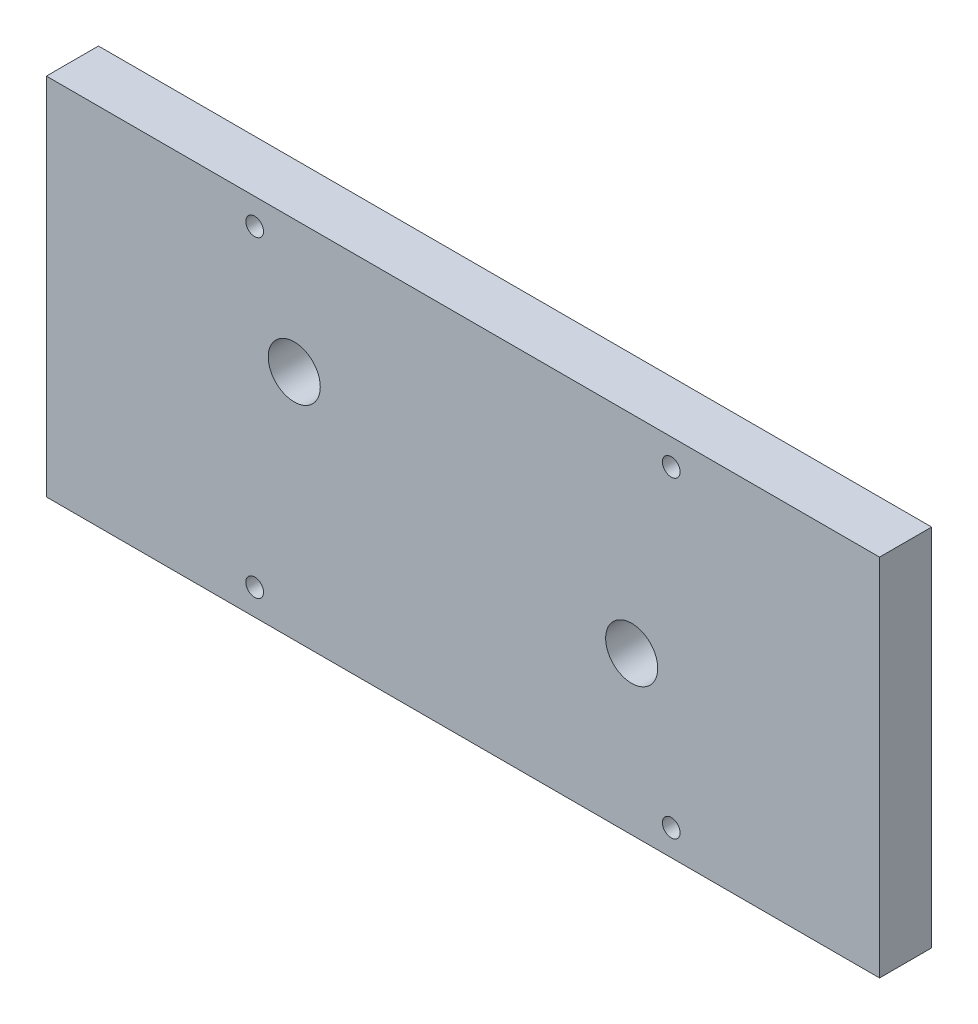
ISO-10303-21;
HEADER;
FILE_DESCRIPTION(('STEP AP214'),'2;1');
FILE_NAME('part.step','',(''),(''),'','','');
FILE_SCHEMA(('AUTOMOTIVE_DESIGN { 1 0 10303 214 1 1 1 1 }'));
ENDSEC;
DATA;
#1=APPLICATION_CONTEXT('core data for automotive mechanical design processes');
#2=APPLICATION_PROTOCOL_DEFINITION('international standard','automotive_design',2000,#1);
#3=PRODUCT_CONTEXT('',#1,'mechanical');
#4=PRODUCT('Part','Part','',(#3));
#5=PRODUCT_RELATED_PRODUCT_CATEGORY('part','',(#4));
#6=PRODUCT_DEFINITION_FORMATION('','',#4);
#7=PRODUCT_DEFINITION_CONTEXT('part definition',#1,'design');
#8=PRODUCT_DEFINITION('design','',#6,#7);
#9=PRODUCT_DEFINITION_SHAPE('','',#8);
#10=(LENGTH_UNIT() NAMED_UNIT(*) SI_UNIT(.MILLI.,.METRE.));
#11=(NAMED_UNIT(*) PLANE_ANGLE_UNIT() SI_UNIT($,.RADIAN.));
#12=(NAMED_UNIT(*) SI_UNIT($,.STERADIAN.) SOLID_ANGLE_UNIT());
#13=UNCERTAINTY_MEASURE_WITH_UNIT(LENGTH_MEASURE(1.E-05),#10,'distance_accuracy_value','');
#14=(GEOMETRIC_REPRESENTATION_CONTEXT(3) GLOBAL_UNCERTAINTY_ASSIGNED_CONTEXT((#13)) GLOBAL_UNIT_ASSIGNED_CONTEXT((#10,
#11,#12)) REPRESENTATION_CONTEXT('',''));
#15=CARTESIAN_POINT('',(0.,0.,0.));
#16=DIRECTION('',(0.,0.,1.));
#17=DIRECTION('',(1.,0.,0.));
#18=AXIS2_PLACEMENT_3D('',#15,#16,#17);
#19=CARTESIAN_POINT('',(-146.819307324439,520.108658774627,82.2731107004053));
#20=DIRECTION('',(1.,0.,0.));
#21=DIRECTION('',(0.,0.,-1.));
#22=AXIS2_PLACEMENT_3D('',#19,#20,#21);
#23=PLANE('',#22);
#24=DIRECTION('',(0.,1.,0.));
#25=VECTOR('',#24,1.);
#26=CARTESIAN_POINT('',(-146.819307324439,520.108658774627,92.2731107004053));
#27=LINE('',#26,#25);
#28=CARTESIAN_POINT('',(-146.819307324439,450.108658774627,92.2731107004053));
#29=VERTEX_POINT('',#28);
#30=CARTESIAN_POINT('',(-146.819307324439,520.108658774627,92.2731107004053));
#31=VERTEX_POINT('',#30);
#32=EDGE_CURVE('E98',#29,#31,#27,.T.);
#33=ORIENTED_EDGE('',*,*,#32,.T.);
#34=DIRECTION('',(0.,0.,1.));
#35=VECTOR('',#34,1.);
#36=CARTESIAN_POINT('',(-146.819307324439,520.108658774627,82.2731107004053));
#37=LINE('',#36,#35);
#38=CARTESIAN_POINT('',(-146.819307324439,520.108658774627,82.2731107004053));
#39=VERTEX_POINT('',#38);
#40=EDGE_CURVE('E11',#39,#31,#37,.T.);
#41=ORIENTED_EDGE('',*,*,#40,.F.);
#42=DIRECTION('',(0.,1.,0.));
#43=VECTOR('',#42,1.);
#44=CARTESIAN_POINT('',(-146.819307324439,520.108658774627,82.2731107004053));
#45=LINE('',#44,#43);
#46=CARTESIAN_POINT('',(-146.819307324439,450.108658774627,82.2731107004053));
#47=VERTEX_POINT('',#46);
#48=EDGE_CURVE('E85',#47,#39,#45,.T.);
#49=ORIENTED_EDGE('',*,*,#48,.F.);
#50=DIRECTION('',(0.,0.,1.));
#51=VECTOR('',#50,1.);
#52=CARTESIAN_POINT('',(-146.819307324439,450.108658774627,82.2731107004053));
#53=LINE('',#52,#51);
#54=EDGE_CURVE('E94',#47,#29,#53,.T.);
#55=ORIENTED_EDGE('',*,*,#54,.T.);
#56=EDGE_LOOP('',(#33,#41,#49,#55));
#57=FACE_BOUND('',#56,.T.);
#58=ADVANCED_FACE('F32',(#57),#23,.F.);
#59=CARTESIAN_POINT('',(-146.819307324439,520.108658774627,82.2731107004053));
#60=DIRECTION('',(0.,-1.,0.));
#61=DIRECTION('',(0.,0.,-1.));
#62=AXIS2_PLACEMENT_3D('',#59,#60,#61);
#63=PLANE('',#62);
#64=DIRECTION('',(1.,0.,0.));
#65=VECTOR('',#64,1.);
#66=CARTESIAN_POINT('',(-146.819307324439,520.108658774627,92.2731107004053));
#67=LINE('',#66,#65);
#68=CARTESIAN_POINT('',(13.1806926755614,520.108658774627,92.2731107004053));
#69=VERTEX_POINT('',#68);
#70=EDGE_CURVE('E89',#31,#69,#67,.T.);
#71=ORIENTED_EDGE('',*,*,#70,.T.);
#72=DIRECTION('',(0.,0.,1.));
#73=VECTOR('',#72,1.);
#74=CARTESIAN_POINT('',(13.1806926755614,520.108658774627,82.2731107004053));
#75=LINE('',#74,#73);
#76=CARTESIAN_POINT('',(13.1806926755614,520.108658774627,82.2731107004053));
#77=VERTEX_POINT('',#76);
#78=EDGE_CURVE('E41',#77,#69,#75,.T.);
#79=ORIENTED_EDGE('',*,*,#78,.F.);
#80=DIRECTION('',(1.,0.,0.));
#81=VECTOR('',#80,1.);
#82=CARTESIAN_POINT('',(-146.819307324439,520.108658774627,82.2731107004053));
#83=LINE('',#82,#81);
#84=EDGE_CURVE('E80',#39,#77,#83,.T.);
#85=ORIENTED_EDGE('',*,*,#84,.F.);
#86=ORIENTED_EDGE('',*,*,#40,.T.);
#87=EDGE_LOOP('',(#71,#79,#85,#86));
#88=FACE_BOUND('',#87,.T.);
#89=ADVANCED_FACE('F88',(#88),#63,.F.);
#90=CARTESIAN_POINT('',(13.1806926755614,520.108658774627,82.2731107004053));
#91=DIRECTION('',(-1.,0.,0.));
#92=DIRECTION('',(0.,-1.,0.));
#93=AXIS2_PLACEMENT_3D('',#90,#91,#92);
#94=PLANE('',#93);
#95=DIRECTION('',(0.,-1.,0.));
#96=VECTOR('',#95,1.);
#97=CARTESIAN_POINT('',(13.1806926755614,520.108658774627,92.2731107004053));
#98=LINE('',#97,#96);
#99=CARTESIAN_POINT('',(13.1806926755614,450.108658774627,92.2731107004053));
#100=VERTEX_POINT('',#99);
#101=EDGE_CURVE('E67',#69,#100,#98,.T.);
#102=ORIENTED_EDGE('',*,*,#101,.T.);
#103=DIRECTION('',(0.,0.,1.));
#104=VECTOR('',#103,1.);
#105=CARTESIAN_POINT('',(13.1806926755614,450.108658774627,82.2731107004053));
#106=LINE('',#105,#104);
#107=CARTESIAN_POINT('',(13.1806926755614,450.108658774627,82.2731107004053));
#108=VERTEX_POINT('',#107);
#109=EDGE_CURVE('E90',#108,#100,#106,.T.);
#110=ORIENTED_EDGE('',*,*,#109,.F.);
#111=DIRECTION('',(0.,-1.,0.));
#112=VECTOR('',#111,1.);
#113=CARTESIAN_POINT('',(13.1806926755614,520.108658774627,82.2731107004053));
#114=LINE('',#113,#112);
#115=EDGE_CURVE('E83',#77,#108,#114,.T.);
#116=ORIENTED_EDGE('',*,*,#115,.F.);
#117=ORIENTED_EDGE('',*,*,#78,.T.);
#118=EDGE_LOOP('',(#102,#110,#116,#117));
#119=FACE_BOUND('',#118,.T.);
#120=ADVANCED_FACE('F92',(#119),#94,.F.);
#121=CARTESIAN_POINT('',(-146.819307324439,450.108658774627,82.2731107004053));
#122=DIRECTION('',(0.,1.,0.));
#123=DIRECTION('',(0.,0.,1.));
#124=AXIS2_PLACEMENT_3D('',#121,#122,#123);
#125=PLANE('',#124);
#126=DIRECTION('',(-1.,0.,0.));
#127=VECTOR('',#126,1.);
#128=CARTESIAN_POINT('',(-146.819307324439,450.108658774627,92.2731107004053));
#129=LINE('',#128,#127);
#130=EDGE_CURVE('E73',#100,#29,#129,.T.);
#131=ORIENTED_EDGE('',*,*,#130,.T.);
#132=ORIENTED_EDGE('',*,*,#54,.F.);
#133=DIRECTION('',(-1.,0.,0.));
#134=VECTOR('',#133,1.);
#135=CARTESIAN_POINT('',(-146.819307324439,450.108658774627,82.2731107004053));
#136=LINE('',#135,#134);
#137=EDGE_CURVE('E50',#108,#47,#136,.T.);
#138=ORIENTED_EDGE('',*,*,#137,.F.);
#139=ORIENTED_EDGE('',*,*,#109,.T.);
#140=EDGE_LOOP('',(#131,#132,#138,#139));
#141=FACE_BOUND('',#140,.T.);
#142=ADVANCED_FACE('F159',(#141),#125,.F.);
#143=CARTESIAN_POINT('',(-146.819307324439,450.108658774627,82.2731107004053));
#144=DIRECTION('',(0.,0.,1.));
#145=DIRECTION('',(1.,0.,0.));
#146=AXIS2_PLACEMENT_3D('',#143,#144,#145);
#147=PLANE('',#146);
#148=CARTESIAN_POINT('',(-99.2193073244386,494.708658774627,82.2731107004053));
#149=DIRECTION('',(0.,0.,1.));
#150=DIRECTION('',(1.,0.,0.));
#151=AXIS2_PLACEMENT_3D('',#148,#149,#150);
#152=CIRCLE('',#151,3.29999999999999);
#153=CARTESIAN_POINT('',(-95.9193073244386,494.708658774627,82.2731107004053));
#154=VERTEX_POINT('',#153);
#155=EDGE_CURVE('E296',#154,#154,#152,.T.);
#156=ORIENTED_EDGE('',*,*,#155,.T.);
#157=EDGE_LOOP('',(#156));
#158=FACE_BOUND('',#157,.T.);
#159=CARTESIAN_POINT('',(-34.4193073244386,480.308658774627,82.2731107004053));
#160=DIRECTION('',(0.,0.,1.));
#161=DIRECTION('',(1.,0.,0.));
#162=AXIS2_PLACEMENT_3D('',#159,#160,#161);
#163=CIRCLE('',#162,3.29999999999999);
#164=CARTESIAN_POINT('',(-31.1193073244386,480.308658774627,82.2731107004053));
#165=VERTEX_POINT('',#164);
#166=EDGE_CURVE('E305',#165,#165,#163,.T.);
#167=ORIENTED_EDGE('',*,*,#166,.T.);
#168=EDGE_LOOP('',(#167));
#169=FACE_BOUND('',#168,.T.);
#170=CARTESIAN_POINT('',(-106.819307324439,515.108658774627,82.2731107004053));
#171=DIRECTION('',(0.,0.,1.));
#172=DIRECTION('',(1.,0.,0.));
#173=AXIS2_PLACEMENT_3D('',#170,#171,#172);
#174=CIRCLE('',#173,1.69999999999999);
#175=CARTESIAN_POINT('',(-105.119307324439,515.108658774627,82.2731107004053));
#176=VERTEX_POINT('',#175);
#177=EDGE_CURVE('E113',#176,#176,#174,.T.);
#178=ORIENTED_EDGE('',*,*,#177,.T.);
#179=EDGE_LOOP('',(#178));
#180=FACE_BOUND('',#179,.T.);
#181=CARTESIAN_POINT('',(-26.8193073244385,515.108658774627,82.2731107004053));
#182=DIRECTION('',(0.,0.,1.));
#183=DIRECTION('',(1.,0.,0.));
#184=AXIS2_PLACEMENT_3D('',#181,#182,#183);
#185=CIRCLE('',#184,1.69999999999999);
#186=CARTESIAN_POINT('',(-25.1193073244385,515.108658774627,82.2731107004053));
#187=VERTEX_POINT('',#186);
#188=EDGE_CURVE('E129',#187,#187,#185,.T.);
#189=ORIENTED_EDGE('',*,*,#188,.T.);
#190=EDGE_LOOP('',(#189));
#191=FACE_BOUND('',#190,.T.);
#192=CARTESIAN_POINT('',(-26.8193073244385,455.108658774627,82.2731107004053));
#193=DIRECTION('',(0.,0.,1.));
#194=DIRECTION('',(1.,0.,0.));
#195=AXIS2_PLACEMENT_3D('',#192,#193,#194);
#196=CIRCLE('',#195,1.69999999999999);
#197=CARTESIAN_POINT('',(-25.1193073244385,455.108658774627,82.2731107004053));
#198=VERTEX_POINT('',#197);
#199=EDGE_CURVE('E135',#198,#198,#196,.T.);
#200=ORIENTED_EDGE('',*,*,#199,.T.);
#201=EDGE_LOOP('',(#200));
#202=FACE_BOUND('',#201,.T.);
#203=CARTESIAN_POINT('',(-106.819307324439,455.108658774627,82.2731107004053));
#204=DIRECTION('',(0.,0.,1.));
#205=DIRECTION('',(1.,0.,0.));
#206=AXIS2_PLACEMENT_3D('',#203,#204,#205);
#207=CIRCLE('',#206,1.69999999999999);
#208=CARTESIAN_POINT('',(-105.119307324439,455.108658774627,82.2731107004053));
#209=VERTEX_POINT('',#208);
#210=EDGE_CURVE('E101',#209,#209,#207,.T.);
#211=ORIENTED_EDGE('',*,*,#210,.T.);
#212=EDGE_LOOP('',(#211));
#213=FACE_BOUND('',#212,.T.);
#214=ORIENTED_EDGE('',*,*,#48,.T.);
#215=ORIENTED_EDGE('',*,*,#84,.T.);
#216=ORIENTED_EDGE('',*,*,#115,.T.);
#217=ORIENTED_EDGE('',*,*,#137,.T.);
#218=EDGE_LOOP('',(#214,#215,#216,#217));
#219=FACE_BOUND('',#218,.T.);
#220=ADVANCED_FACE('F81',(#158,#169,#180,#191,#202,#213,#219),#147,.F.);
#221=CARTESIAN_POINT('',(-146.819307324439,450.108658774627,92.2731107004053));
#222=DIRECTION('',(0.,0.,1.));
#223=DIRECTION('',(1.,0.,0.));
#224=AXIS2_PLACEMENT_3D('',#221,#222,#223);
#225=PLANE('',#224);
#226=CARTESIAN_POINT('',(-99.2193073244386,494.708658774627,92.2731107004053));
#227=DIRECTION('',(0.,0.,1.));
#228=DIRECTION('',(1.,0.,0.));
#229=AXIS2_PLACEMENT_3D('',#226,#227,#228);
#230=CIRCLE('',#229,5.00000000000001);
#231=CARTESIAN_POINT('',(-94.2193073244386,494.708658774627,92.2731107004053));
#232=VERTEX_POINT('',#231);
#233=EDGE_CURVE('E35',#232,#232,#230,.T.);
#234=ORIENTED_EDGE('',*,*,#233,.F.);
#235=EDGE_LOOP('',(#234));
#236=FACE_BOUND('',#235,.T.);
#237=CARTESIAN_POINT('',(-34.4193073244386,480.308658774627,92.2731107004053));
#238=DIRECTION('',(0.,0.,1.));
#239=DIRECTION('',(1.,0.,0.));
#240=AXIS2_PLACEMENT_3D('',#237,#238,#239);
#241=CIRCLE('',#240,5.);
#242=CARTESIAN_POINT('',(-29.4193073244386,480.308658774627,92.2731107004053));
#243=VERTEX_POINT('',#242);
#244=EDGE_CURVE('E106',#243,#243,#241,.T.);
#245=ORIENTED_EDGE('',*,*,#244,.F.);
#246=EDGE_LOOP('',(#245));
#247=FACE_BOUND('',#246,.T.);
#248=CARTESIAN_POINT('',(-106.819307324439,515.108658774627,92.2731107004053));
#249=DIRECTION('',(0.,0.,1.));
#250=DIRECTION('',(1.,0.,0.));
#251=AXIS2_PLACEMENT_3D('',#248,#249,#250);
#252=CIRCLE('',#251,1.69999999999999);
#253=CARTESIAN_POINT('',(-105.119307324439,515.108658774627,92.2731107004053));
#254=VERTEX_POINT('',#253);
#255=EDGE_CURVE('E108',#254,#254,#252,.T.);
#256=ORIENTED_EDGE('',*,*,#255,.F.);
#257=EDGE_LOOP('',(#256));
#258=FACE_BOUND('',#257,.T.);
#259=CARTESIAN_POINT('',(-26.8193073244385,515.108658774627,92.2731107004053));
#260=DIRECTION('',(0.,0.,1.));
#261=DIRECTION('',(1.,0.,0.));
#262=AXIS2_PLACEMENT_3D('',#259,#260,#261);
#263=CIRCLE('',#262,1.69999999999999);
#264=CARTESIAN_POINT('',(-25.1193073244386,515.108658774627,92.2731107004053));
#265=VERTEX_POINT('',#264);
#266=EDGE_CURVE('E126',#265,#265,#263,.T.);
#267=ORIENTED_EDGE('',*,*,#266,.F.);
#268=EDGE_LOOP('',(#267));
#269=FACE_BOUND('',#268,.T.);
#270=CARTESIAN_POINT('',(-26.8193073244385,455.108658774627,92.2731107004053));
#271=DIRECTION('',(0.,0.,1.));
#272=DIRECTION('',(1.,0.,0.));
#273=AXIS2_PLACEMENT_3D('',#270,#271,#272);
#274=CIRCLE('',#273,1.69999999999999);
#275=CARTESIAN_POINT('',(-25.1193073244386,455.108658774627,92.2731107004053));
#276=VERTEX_POINT('',#275);
#277=EDGE_CURVE('E132',#276,#276,#274,.T.);
#278=ORIENTED_EDGE('',*,*,#277,.F.);
#279=EDGE_LOOP('',(#278));
#280=FACE_BOUND('',#279,.T.);
#281=CARTESIAN_POINT('',(-106.819307324439,455.108658774627,92.2731107004053));
#282=DIRECTION('',(0.,0.,1.));
#283=DIRECTION('',(1.,0.,0.));
#284=AXIS2_PLACEMENT_3D('',#281,#282,#283);
#285=CIRCLE('',#284,1.69999999999999);
#286=CARTESIAN_POINT('',(-105.119307324439,455.108658774627,92.2731107004053));
#287=VERTEX_POINT('',#286);
#288=EDGE_CURVE('E138',#287,#287,#285,.T.);
#289=ORIENTED_EDGE('',*,*,#288,.F.);
#290=EDGE_LOOP('',(#289));
#291=FACE_BOUND('',#290,.T.);
#292=ORIENTED_EDGE('',*,*,#32,.F.);
#293=ORIENTED_EDGE('',*,*,#130,.F.);
#294=ORIENTED_EDGE('',*,*,#101,.F.);
#295=ORIENTED_EDGE('',*,*,#70,.F.);
#296=EDGE_LOOP('',(#292,#293,#294,#295));
#297=FACE_BOUND('',#296,.T.);
#298=ADVANCED_FACE('F149',(#236,#247,#258,#269,#280,#291,#297),#225,.T.);
#299=CARTESIAN_POINT('',(-106.819307324439,455.108658774627,92.2731107004053));
#300=DIRECTION('',(0.,0.,1.));
#301=DIRECTION('',(1.,0.,0.));
#302=AXIS2_PLACEMENT_3D('',#299,#300,#301);
#303=CYLINDRICAL_SURFACE('',#302,1.69999999999999);
#304=ORIENTED_EDGE('',*,*,#210,.F.);
#305=EDGE_LOOP('',(#304));
#306=FACE_BOUND('',#305,.T.);
#307=ORIENTED_EDGE('',*,*,#288,.T.);
#308=EDGE_LOOP('',(#307));
#309=FACE_BOUND('',#308,.T.);
#310=ADVANCED_FACE('F145',(#306,#309),#303,.F.);
#311=CARTESIAN_POINT('',(-26.8193073244385,455.108658774627,92.2731107004053));
#312=DIRECTION('',(0.,0.,1.));
#313=DIRECTION('',(1.,0.,0.));
#314=AXIS2_PLACEMENT_3D('',#311,#312,#313);
#315=CYLINDRICAL_SURFACE('',#314,1.69999999999999);
#316=ORIENTED_EDGE('',*,*,#199,.F.);
#317=EDGE_LOOP('',(#316));
#318=FACE_BOUND('',#317,.T.);
#319=ORIENTED_EDGE('',*,*,#277,.T.);
#320=EDGE_LOOP('',(#319));
#321=FACE_BOUND('',#320,.T.);
#322=ADVANCED_FACE('F148',(#318,#321),#315,.F.);
#323=CARTESIAN_POINT('',(-26.8193073244385,515.108658774627,92.2731107004053));
#324=DIRECTION('',(0.,0.,1.));
#325=DIRECTION('',(1.,0.,0.));
#326=AXIS2_PLACEMENT_3D('',#323,#324,#325);
#327=CYLINDRICAL_SURFACE('',#326,1.69999999999999);
#328=ORIENTED_EDGE('',*,*,#188,.F.);
#329=EDGE_LOOP('',(#328));
#330=FACE_BOUND('',#329,.T.);
#331=ORIENTED_EDGE('',*,*,#266,.T.);
#332=EDGE_LOOP('',(#331));
#333=FACE_BOUND('',#332,.T.);
#334=ADVANCED_FACE('F200',(#330,#333),#327,.F.);
#335=CARTESIAN_POINT('',(-106.819307324439,515.108658774627,92.2731107004053));
#336=DIRECTION('',(0.,0.,1.));
#337=DIRECTION('',(1.,0.,0.));
#338=AXIS2_PLACEMENT_3D('',#335,#336,#337);
#339=CYLINDRICAL_SURFACE('',#338,1.69999999999999);
#340=ORIENTED_EDGE('',*,*,#177,.F.);
#341=EDGE_LOOP('',(#340));
#342=FACE_BOUND('',#341,.T.);
#343=ORIENTED_EDGE('',*,*,#255,.T.);
#344=EDGE_LOOP('',(#343));
#345=FACE_BOUND('',#344,.T.);
#346=ADVANCED_FACE('F210',(#342,#345),#339,.F.);
#347=CARTESIAN_POINT('',(-34.4193073244386,480.308658774627,83.7731107004053));
#348=DIRECTION('',(0.,0.,1.));
#349=DIRECTION('',(1.,0.,0.));
#350=AXIS2_PLACEMENT_3D('',#347,#348,#349);
#351=CYLINDRICAL_SURFACE('',#350,5.);
#352=ORIENTED_EDGE('',*,*,#244,.T.);
#353=EDGE_LOOP('',(#352));
#354=FACE_BOUND('',#353,.T.);
#355=CARTESIAN_POINT('',(-34.4193073244386,480.308658774627,83.7731107004053));
#356=DIRECTION('',(0.,0.,1.));
#357=DIRECTION('',(1.,0.,0.));
#358=AXIS2_PLACEMENT_3D('',#355,#356,#357);
#359=CIRCLE('',#358,5.);
#360=CARTESIAN_POINT('',(-29.4193073244386,480.308658774627,83.7731107004053));
#361=VERTEX_POINT('',#360);
#362=EDGE_CURVE('E109',#361,#361,#359,.T.);
#363=ORIENTED_EDGE('',*,*,#362,.F.);
#364=EDGE_LOOP('',(#363));
#365=FACE_BOUND('',#364,.T.);
#366=ADVANCED_FACE('F220',(#354,#365),#351,.F.);
#367=CARTESIAN_POINT('',(-34.4193073244386,480.308658774627,83.7731107004053));
#368=DIRECTION('',(0.,0.,1.));
#369=DIRECTION('',(1.,0.,0.));
#370=AXIS2_PLACEMENT_3D('',#367,#368,#369);
#371=PLANE('',#370);
#372=CARTESIAN_POINT('',(-34.4193073244386,480.308658774627,83.7731107004053));
#373=DIRECTION('',(0.,0.,1.));
#374=DIRECTION('',(1.,0.,0.));
#375=AXIS2_PLACEMENT_3D('',#372,#373,#374);
#376=CIRCLE('',#375,3.29999999999999);
#377=CARTESIAN_POINT('',(-31.1193073244386,480.308658774627,83.7731107004053));
#378=VERTEX_POINT('',#377);
#379=EDGE_CURVE('E301',#378,#378,#376,.T.);
#380=ORIENTED_EDGE('',*,*,#379,.F.);
#381=EDGE_LOOP('',(#380));
#382=FACE_BOUND('',#381,.T.);
#383=ORIENTED_EDGE('',*,*,#362,.T.);
#384=EDGE_LOOP('',(#383));
#385=FACE_BOUND('',#384,.T.);
#386=ADVANCED_FACE('F235',(#382,#385),#371,.T.);
#387=CARTESIAN_POINT('',(-99.2193073244386,494.708658774627,83.7731107004053));
#388=DIRECTION('',(0.,0.,1.));
#389=DIRECTION('',(1.,0.,0.));
#390=AXIS2_PLACEMENT_3D('',#387,#388,#389);
#391=CYLINDRICAL_SURFACE('',#390,5.00000000000001);
#392=ORIENTED_EDGE('',*,*,#233,.T.);
#393=EDGE_LOOP('',(#392));
#394=FACE_BOUND('',#393,.T.);
#395=CARTESIAN_POINT('',(-99.2193073244386,494.708658774627,83.7731107004053));
#396=DIRECTION('',(0.,0.,1.));
#397=DIRECTION('',(1.,0.,0.));
#398=AXIS2_PLACEMENT_3D('',#395,#396,#397);
#399=CIRCLE('',#398,5.00000000000001);
#400=CARTESIAN_POINT('',(-94.2193073244386,494.708658774627,83.7731107004053));
#401=VERTEX_POINT('',#400);
#402=EDGE_CURVE('E120',#401,#401,#399,.T.);
#403=ORIENTED_EDGE('',*,*,#402,.F.);
#404=EDGE_LOOP('',(#403));
#405=FACE_BOUND('',#404,.T.);
#406=ADVANCED_FACE('F242',(#394,#405),#391,.F.);
#407=CARTESIAN_POINT('',(-99.2193073244386,494.708658774627,83.7731107004053));
#408=DIRECTION('',(0.,0.,1.));
#409=DIRECTION('',(1.,0.,0.));
#410=AXIS2_PLACEMENT_3D('',#407,#408,#409);
#411=PLANE('',#410);
#412=CARTESIAN_POINT('',(-99.2193073244386,494.708658774627,83.7731107004053));
#413=DIRECTION('',(0.,0.,1.));
#414=DIRECTION('',(1.,0.,0.));
#415=AXIS2_PLACEMENT_3D('',#412,#413,#414);
#416=CIRCLE('',#415,3.29999999999998);
#417=CARTESIAN_POINT('',(-95.9193073244386,494.708658774627,83.7731107004053));
#418=VERTEX_POINT('',#417);
#419=EDGE_CURVE('E299',#418,#418,#416,.T.);
#420=ORIENTED_EDGE('',*,*,#419,.F.);
#421=EDGE_LOOP('',(#420));
#422=FACE_BOUND('',#421,.T.);
#423=ORIENTED_EDGE('',*,*,#402,.T.);
#424=EDGE_LOOP('',(#423));
#425=FACE_BOUND('',#424,.T.);
#426=ADVANCED_FACE('F247',(#422,#425),#411,.T.);
#427=CARTESIAN_POINT('',(-34.4193073244386,480.308658774627,83.7731107004053));
#428=DIRECTION('',(0.,0.,1.));
#429=DIRECTION('',(1.,0.,0.));
#430=AXIS2_PLACEMENT_3D('',#427,#428,#429);
#431=CYLINDRICAL_SURFACE('',#430,3.29999999999999);
#432=ORIENTED_EDGE('',*,*,#166,.F.);
#433=EDGE_LOOP('',(#432));
#434=FACE_BOUND('',#433,.T.);
#435=ORIENTED_EDGE('',*,*,#379,.T.);
#436=EDGE_LOOP('',(#435));
#437=FACE_BOUND('',#436,.T.);
#438=ADVANCED_FACE('F269',(#434,#437),#431,.F.);
#439=CARTESIAN_POINT('',(-99.2193073244386,494.708658774627,83.7731107004053));
#440=DIRECTION('',(0.,0.,1.));
#441=DIRECTION('',(1.,0.,0.));
#442=AXIS2_PLACEMENT_3D('',#439,#440,#441);
#443=CYLINDRICAL_SURFACE('',#442,3.29999999999999);
#444=ORIENTED_EDGE('',*,*,#155,.F.);
#445=EDGE_LOOP('',(#444));
#446=FACE_BOUND('',#445,.T.);
#447=ORIENTED_EDGE('',*,*,#419,.T.);
#448=EDGE_LOOP('',(#447));
#449=FACE_BOUND('',#448,.T.);
#450=ADVANCED_FACE('F279',(#446,#449),#443,.F.);
#451=CLOSED_SHELL('',(#58,#89,#120,#142,#220,#298,#310,#322,#334,#346,#366,#386,#406,#426,#438,#450));
#452=MANIFOLD_SOLID_BREP('B2',#451);
#453=ADVANCED_BREP_SHAPE_REPRESENTATION('',(#18,#452),#14);
#454=SHAPE_DEFINITION_REPRESENTATION(#9,#453);
ENDSEC;
END-ISO-10303-21;
